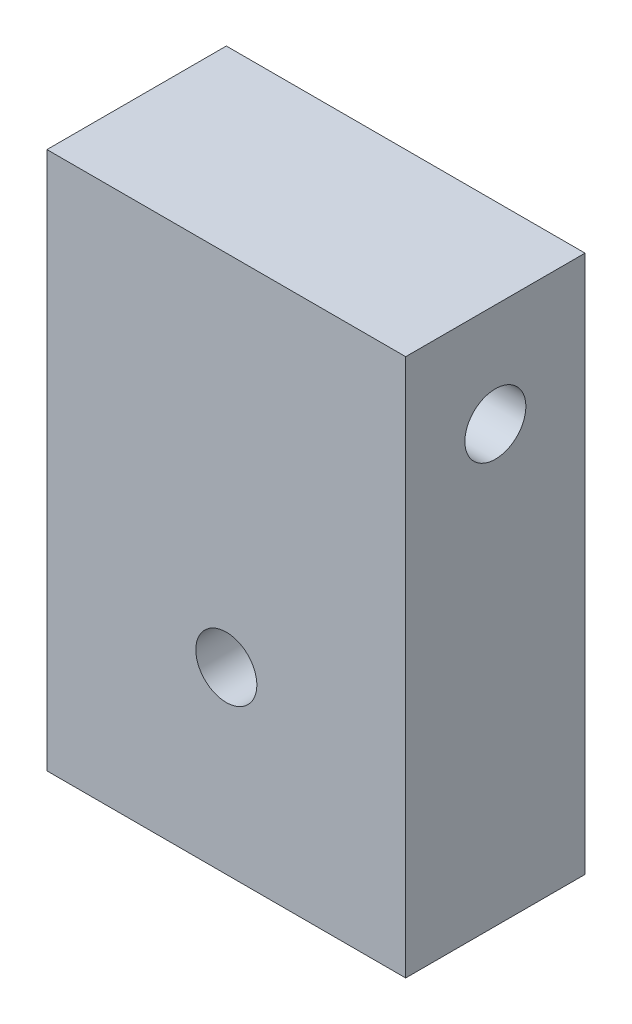
ISO-10303-21;
HEADER;
FILE_DESCRIPTION(('STEP AP214'),'2;1');
FILE_NAME('part.step','',(''),(''),'','','');
FILE_SCHEMA(('AUTOMOTIVE_DESIGN { 1 0 10303 214 1 1 1 1 }'));
ENDSEC;
DATA;
#1=APPLICATION_CONTEXT('core data for automotive mechanical design processes');
#2=APPLICATION_PROTOCOL_DEFINITION('international standard','automotive_design',2000,#1);
#3=PRODUCT_CONTEXT('',#1,'mechanical');
#4=PRODUCT('Part','Part','',(#3));
#5=PRODUCT_RELATED_PRODUCT_CATEGORY('part','',(#4));
#6=PRODUCT_DEFINITION_FORMATION('','',#4);
#7=PRODUCT_DEFINITION_CONTEXT('part definition',#1,'design');
#8=PRODUCT_DEFINITION('design','',#6,#7);
#9=PRODUCT_DEFINITION_SHAPE('','',#8);
#10=(LENGTH_UNIT() NAMED_UNIT(*) SI_UNIT(.MILLI.,.METRE.));
#11=(NAMED_UNIT(*) PLANE_ANGLE_UNIT() SI_UNIT($,.RADIAN.));
#12=(NAMED_UNIT(*) SI_UNIT($,.STERADIAN.) SOLID_ANGLE_UNIT());
#13=UNCERTAINTY_MEASURE_WITH_UNIT(LENGTH_MEASURE(1.E-05),#10,'distance_accuracy_value','');
#14=(GEOMETRIC_REPRESENTATION_CONTEXT(3) GLOBAL_UNCERTAINTY_ASSIGNED_CONTEXT((#13)) GLOBAL_UNIT_ASSIGNED_CONTEXT((#10,
#11,#12)) REPRESENTATION_CONTEXT('',''));
#15=CARTESIAN_POINT('',(0.,0.,0.));
#16=DIRECTION('',(0.,0.,1.));
#17=DIRECTION('',(1.,0.,0.));
#18=AXIS2_PLACEMENT_3D('',#15,#16,#17);
#19=CARTESIAN_POINT('',(10.,9.25,5.));
#20=DIRECTION('',(-1.,0.,0.));
#21=DIRECTION('',(0.,-1.,0.));
#22=AXIS2_PLACEMENT_3D('',#19,#20,#21);
#23=CYLINDRICAL_SURFACE('',#22,1.7);
#24=CARTESIAN_POINT('',(10.,9.25,5.));
#25=DIRECTION('',(-1.,0.,0.));
#26=DIRECTION('',(0.,-1.,0.));
#27=AXIS2_PLACEMENT_3D('',#24,#25,#26);
#28=CIRCLE('',#27,1.7);
#29=CARTESIAN_POINT('',(10.,7.55,5.));
#30=VERTEX_POINT('',#29);
#31=EDGE_CURVE('E70',#30,#30,#28,.F.);
#32=ORIENTED_EDGE('',*,*,#31,.T.);
#33=EDGE_LOOP('',(#32));
#34=FACE_BOUND('',#33,.T.);
#35=CARTESIAN_POINT('',(-10.,9.25,5.));
#36=DIRECTION('',(-1.,0.,0.));
#37=DIRECTION('',(0.,-1.,0.));
#38=AXIS2_PLACEMENT_3D('',#35,#36,#37);
#39=CIRCLE('',#38,1.7);
#40=CARTESIAN_POINT('',(-10.,7.55,5.));
#41=VERTEX_POINT('',#40);
#42=EDGE_CURVE('E76',#41,#41,#39,.T.);
#43=ORIENTED_EDGE('',*,*,#42,.T.);
#44=EDGE_LOOP('',(#43));
#45=FACE_BOUND('',#44,.T.);
#46=ADVANCED_FACE('F17',(#34,#45),#23,.F.);
#47=CARTESIAN_POINT('',(0.,0.,0.));
#48=DIRECTION('',(0.,0.,1.));
#49=DIRECTION('',(1.,0.,0.));
#50=AXIS2_PLACEMENT_3D('',#47,#48,#49);
#51=PLANE('',#50);
#52=DIRECTION('',(1.,0.,0.));
#53=VECTOR('',#52,1.);
#54=CARTESIAN_POINT('',(-10.,-15.,0.));
#55=LINE('',#54,#53);
#56=CARTESIAN_POINT('',(10.,-15.,0.));
#57=VERTEX_POINT('',#56);
#58=CARTESIAN_POINT('',(-10.,-15.,0.));
#59=VERTEX_POINT('',#58);
#60=EDGE_CURVE('E89',#57,#59,#55,.F.);
#61=ORIENTED_EDGE('',*,*,#60,.T.);
#62=DIRECTION('',(0.,1.,0.));
#63=VECTOR('',#62,1.);
#64=CARTESIAN_POINT('',(-10.,15.,0.));
#65=LINE('',#64,#63);
#66=CARTESIAN_POINT('',(-10.,15.,0.));
#67=VERTEX_POINT('',#66);
#68=EDGE_CURVE('E74',#59,#67,#65,.T.);
#69=ORIENTED_EDGE('',*,*,#68,.T.);
#70=DIRECTION('',(1.,0.,0.));
#71=VECTOR('',#70,1.);
#72=CARTESIAN_POINT('',(-10.,15.,0.));
#73=LINE('',#72,#71);
#74=CARTESIAN_POINT('',(10.,15.,0.));
#75=VERTEX_POINT('',#74);
#76=EDGE_CURVE('E55',#67,#75,#73,.T.);
#77=ORIENTED_EDGE('',*,*,#76,.T.);
#78=DIRECTION('',(0.,-1.,0.));
#79=VECTOR('',#78,1.);
#80=CARTESIAN_POINT('',(10.,15.,0.));
#81=LINE('',#80,#79);
#82=EDGE_CURVE('E60',#75,#57,#81,.T.);
#83=ORIENTED_EDGE('',*,*,#82,.T.);
#84=EDGE_LOOP('',(#61,#69,#77,#83));
#85=FACE_BOUND('',#84,.T.);
#86=CARTESIAN_POINT('',(0.,-5.,0.));
#87=DIRECTION('',(0.,0.,-1.));
#88=DIRECTION('',(-1.,0.,0.));
#89=AXIS2_PLACEMENT_3D('',#86,#87,#88);
#90=CIRCLE('',#89,1.7);
#91=CARTESIAN_POINT('',(-1.7,-5.,0.));
#92=VERTEX_POINT('',#91);
#93=EDGE_CURVE('E20',#92,#92,#90,.F.);
#94=ORIENTED_EDGE('',*,*,#93,.T.);
#95=EDGE_LOOP('',(#94));
#96=FACE_BOUND('',#95,.T.);
#97=ADVANCED_FACE('F72',(#85,#96),#51,.F.);
#98=CARTESIAN_POINT('',(0.,-5.,10.));
#99=DIRECTION('',(0.,0.,-1.));
#100=DIRECTION('',(-1.,0.,0.));
#101=AXIS2_PLACEMENT_3D('',#98,#99,#100);
#102=CYLINDRICAL_SURFACE('',#101,1.7);
#103=ORIENTED_EDGE('',*,*,#93,.F.);
#104=EDGE_LOOP('',(#103));
#105=FACE_BOUND('',#104,.T.);
#106=CARTESIAN_POINT('',(0.,-5.,10.));
#107=DIRECTION('',(0.,0.,-1.));
#108=DIRECTION('',(-1.,0.,0.));
#109=AXIS2_PLACEMENT_3D('',#106,#107,#108);
#110=CIRCLE('',#109,1.7);
#111=CARTESIAN_POINT('',(-1.7,-5.,10.));
#112=VERTEX_POINT('',#111);
#113=EDGE_CURVE('E85',#112,#112,#110,.T.);
#114=ORIENTED_EDGE('',*,*,#113,.F.);
#115=EDGE_LOOP('',(#114));
#116=FACE_BOUND('',#115,.T.);
#117=ADVANCED_FACE('F98',(#105,#116),#102,.F.);
#118=CARTESIAN_POINT('',(10.,15.,10.));
#119=DIRECTION('',(-1.,0.,0.));
#120=DIRECTION('',(0.,-1.,0.));
#121=AXIS2_PLACEMENT_3D('',#118,#119,#120);
#122=PLANE('',#121);
#123=DIRECTION('',(0.,0.,-1.));
#124=VECTOR('',#123,1.);
#125=CARTESIAN_POINT('',(10.,15.,10.));
#126=LINE('',#125,#124);
#127=CARTESIAN_POINT('',(10.,15.,10.));
#128=VERTEX_POINT('',#127);
#129=EDGE_CURVE('E63',#75,#128,#126,.F.);
#130=ORIENTED_EDGE('',*,*,#129,.T.);
#131=DIRECTION('',(0.,1.,0.));
#132=VECTOR('',#131,1.);
#133=CARTESIAN_POINT('',(10.,0.,10.));
#134=LINE('',#133,#132);
#135=CARTESIAN_POINT('',(10.,-15.,10.));
#136=VERTEX_POINT('',#135);
#137=EDGE_CURVE('E88',#136,#128,#134,.T.);
#138=ORIENTED_EDGE('',*,*,#137,.F.);
#139=DIRECTION('',(0.,0.,1.));
#140=VECTOR('',#139,1.);
#141=CARTESIAN_POINT('',(10.,-15.,10.));
#142=LINE('',#141,#140);
#143=EDGE_CURVE('E66',#136,#57,#142,.F.);
#144=ORIENTED_EDGE('',*,*,#143,.T.);
#145=ORIENTED_EDGE('',*,*,#82,.F.);
#146=EDGE_LOOP('',(#130,#138,#144,#145));
#147=FACE_BOUND('',#146,.T.);
#148=ORIENTED_EDGE('',*,*,#31,.F.);
#149=EDGE_LOOP('',(#148));
#150=FACE_BOUND('',#149,.T.);
#151=ADVANCED_FACE('F61',(#147,#150),#122,.F.);
#152=CARTESIAN_POINT('',(-10.,15.,10.));
#153=DIRECTION('',(0.,-1.,0.));
#154=DIRECTION('',(0.,0.,-1.));
#155=AXIS2_PLACEMENT_3D('',#152,#153,#154);
#156=PLANE('',#155);
#157=DIRECTION('',(0.,0.,1.));
#158=VECTOR('',#157,1.);
#159=CARTESIAN_POINT('',(-10.,15.,10.));
#160=LINE('',#159,#158);
#161=CARTESIAN_POINT('',(-10.,15.,10.));
#162=VERTEX_POINT('',#161);
#163=EDGE_CURVE('E91',#67,#162,#160,.T.);
#164=ORIENTED_EDGE('',*,*,#163,.T.);
#165=DIRECTION('',(1.,0.,0.));
#166=VECTOR('',#165,1.);
#167=CARTESIAN_POINT('',(0.,15.,10.));
#168=LINE('',#167,#166);
#169=EDGE_CURVE('E80',#128,#162,#168,.F.);
#170=ORIENTED_EDGE('',*,*,#169,.F.);
#171=ORIENTED_EDGE('',*,*,#129,.F.);
#172=ORIENTED_EDGE('',*,*,#76,.F.);
#173=EDGE_LOOP('',(#164,#170,#171,#172));
#174=FACE_BOUND('',#173,.T.);
#175=ADVANCED_FACE('F78',(#174),#156,.F.);
#176=CARTESIAN_POINT('',(-10.,15.,10.));
#177=DIRECTION('',(1.,0.,0.));
#178=DIRECTION('',(0.,1.,0.));
#179=AXIS2_PLACEMENT_3D('',#176,#177,#178);
#180=PLANE('',#179);
#181=DIRECTION('',(0.,0.,1.));
#182=VECTOR('',#181,1.);
#183=CARTESIAN_POINT('',(-10.,-15.,10.));
#184=LINE('',#183,#182);
#185=CARTESIAN_POINT('',(-10.,-15.,10.));
#186=VERTEX_POINT('',#185);
#187=EDGE_CURVE('E35',#59,#186,#184,.T.);
#188=ORIENTED_EDGE('',*,*,#187,.T.);
#189=DIRECTION('',(0.,1.,0.));
#190=VECTOR('',#189,1.);
#191=CARTESIAN_POINT('',(-10.,0.,10.));
#192=LINE('',#191,#190);
#193=EDGE_CURVE('E26',#162,#186,#192,.F.);
#194=ORIENTED_EDGE('',*,*,#193,.F.);
#195=ORIENTED_EDGE('',*,*,#163,.F.);
#196=ORIENTED_EDGE('',*,*,#68,.F.);
#197=EDGE_LOOP('',(#188,#194,#195,#196));
#198=FACE_BOUND('',#197,.T.);
#199=ORIENTED_EDGE('',*,*,#42,.F.);
#200=EDGE_LOOP('',(#199));
#201=FACE_BOUND('',#200,.T.);
#202=ADVANCED_FACE('F113',(#198,#201),#180,.F.);
#203=CARTESIAN_POINT('',(-10.,-15.,10.));
#204=DIRECTION('',(0.,1.,0.));
#205=DIRECTION('',(0.,0.,1.));
#206=AXIS2_PLACEMENT_3D('',#203,#204,#205);
#207=PLANE('',#206);
#208=ORIENTED_EDGE('',*,*,#143,.F.);
#209=DIRECTION('',(1.,0.,0.));
#210=VECTOR('',#209,1.);
#211=CARTESIAN_POINT('',(0.,-15.,10.));
#212=LINE('',#211,#210);
#213=EDGE_CURVE('E11',#186,#136,#212,.T.);
#214=ORIENTED_EDGE('',*,*,#213,.F.);
#215=ORIENTED_EDGE('',*,*,#187,.F.);
#216=ORIENTED_EDGE('',*,*,#60,.F.);
#217=EDGE_LOOP('',(#208,#214,#215,#216));
#218=FACE_BOUND('',#217,.T.);
#219=ADVANCED_FACE('F106',(#218),#207,.F.);
#220=CARTESIAN_POINT('',(0.,0.,10.));
#221=DIRECTION('',(0.,0.,1.));
#222=DIRECTION('',(1.,0.,0.));
#223=AXIS2_PLACEMENT_3D('',#220,#221,#222);
#224=PLANE('',#223);
#225=ORIENTED_EDGE('',*,*,#193,.T.);
#226=ORIENTED_EDGE('',*,*,#213,.T.);
#227=ORIENTED_EDGE('',*,*,#137,.T.);
#228=ORIENTED_EDGE('',*,*,#169,.T.);
#229=EDGE_LOOP('',(#225,#226,#227,#228));
#230=FACE_BOUND('',#229,.T.);
#231=ORIENTED_EDGE('',*,*,#113,.T.);
#232=EDGE_LOOP('',(#231));
#233=FACE_BOUND('',#232,.T.);
#234=ADVANCED_FACE('F104',(#230,#233),#224,.T.);
#235=CLOSED_SHELL('',(#46,#97,#117,#151,#175,#202,#219,#234));
#236=MANIFOLD_SOLID_BREP('B1',#235);
#237=ADVANCED_BREP_SHAPE_REPRESENTATION('',(#18,#236),#14);
#238=SHAPE_DEFINITION_REPRESENTATION(#9,#237);
ENDSEC;
END-ISO-10303-21;
